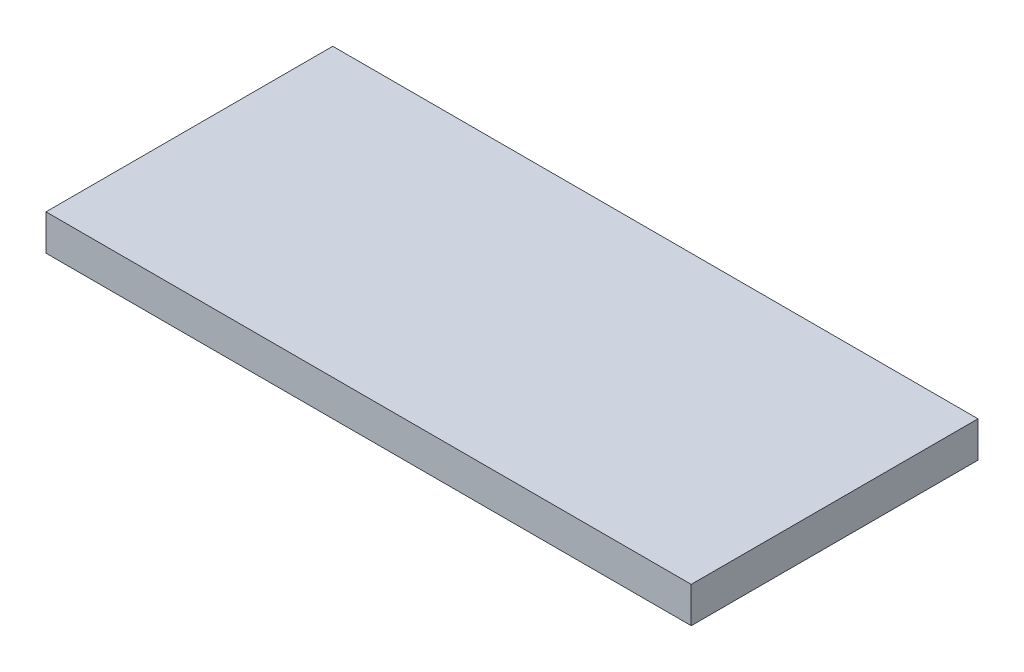
ISO-10303-21;
HEADER;
FILE_DESCRIPTION(('STEP AP214'),'2;1');
FILE_NAME('part.step','',(''),(''),'','','');
FILE_SCHEMA(('AUTOMOTIVE_DESIGN { 1 0 10303 214 1 1 1 1 }'));
ENDSEC;
DATA;
#1=APPLICATION_CONTEXT('core data for automotive mechanical design processes');
#2=APPLICATION_PROTOCOL_DEFINITION('international standard','automotive_design',2000,#1);
#3=PRODUCT_CONTEXT('',#1,'mechanical');
#4=PRODUCT('Part','Part','',(#3));
#5=PRODUCT_RELATED_PRODUCT_CATEGORY('part','',(#4));
#6=PRODUCT_DEFINITION_FORMATION('','',#4);
#7=PRODUCT_DEFINITION_CONTEXT('part definition',#1,'design');
#8=PRODUCT_DEFINITION('design','',#6,#7);
#9=PRODUCT_DEFINITION_SHAPE('','',#8);
#10=(LENGTH_UNIT() NAMED_UNIT(*) SI_UNIT(.MILLI.,.METRE.));
#11=(NAMED_UNIT(*) PLANE_ANGLE_UNIT() SI_UNIT($,.RADIAN.));
#12=(NAMED_UNIT(*) SI_UNIT($,.STERADIAN.) SOLID_ANGLE_UNIT());
#13=UNCERTAINTY_MEASURE_WITH_UNIT(LENGTH_MEASURE(1.E-05),#10,'distance_accuracy_value','');
#14=(GEOMETRIC_REPRESENTATION_CONTEXT(3) GLOBAL_UNCERTAINTY_ASSIGNED_CONTEXT((#13)) GLOBAL_UNIT_ASSIGNED_CONTEXT((#10,
#11,#12)) REPRESENTATION_CONTEXT('',''));
#15=CARTESIAN_POINT('',(0.,0.,0.));
#16=DIRECTION('',(0.,0.,1.));
#17=DIRECTION('',(1.,0.,0.));
#18=AXIS2_PLACEMENT_3D('',#15,#16,#17);
#19=CARTESIAN_POINT('',(450.,50.,-200.));
#20=DIRECTION('',(-1.,0.,0.));
#21=DIRECTION('',(0.,0.,1.));
#22=AXIS2_PLACEMENT_3D('',#19,#20,#21);
#23=PLANE('',#22);
#24=DIRECTION('',(0.,0.,-1.));
#25=VECTOR('',#24,1.);
#26=CARTESIAN_POINT('',(450.,0.,-200.));
#27=LINE('',#26,#25);
#28=CARTESIAN_POINT('',(450.,0.,200.));
#29=VERTEX_POINT('',#28);
#30=CARTESIAN_POINT('',(450.,0.,-200.));
#31=VERTEX_POINT('',#30);
#32=EDGE_CURVE('E97',#29,#31,#27,.T.);
#33=ORIENTED_EDGE('',*,*,#32,.T.);
#34=DIRECTION('',(0.,-1.,0.));
#35=VECTOR('',#34,1.);
#36=CARTESIAN_POINT('',(450.,50.,-200.));
#37=LINE('',#36,#35);
#38=CARTESIAN_POINT('',(450.,50.,-200.));
#39=VERTEX_POINT('',#38);
#40=EDGE_CURVE('E11',#39,#31,#37,.T.);
#41=ORIENTED_EDGE('',*,*,#40,.F.);
#42=DIRECTION('',(0.,0.,-1.));
#43=VECTOR('',#42,1.);
#44=CARTESIAN_POINT('',(450.,50.,-200.));
#45=LINE('',#44,#43);
#46=CARTESIAN_POINT('',(450.,50.,200.));
#47=VERTEX_POINT('',#46);
#48=EDGE_CURVE('E85',#47,#39,#45,.T.);
#49=ORIENTED_EDGE('',*,*,#48,.F.);
#50=DIRECTION('',(0.,-1.,0.));
#51=VECTOR('',#50,1.);
#52=CARTESIAN_POINT('',(450.,50.,200.));
#53=LINE('',#52,#51);
#54=EDGE_CURVE('E93',#47,#29,#53,.T.);
#55=ORIENTED_EDGE('',*,*,#54,.T.);
#56=EDGE_LOOP('',(#33,#41,#49,#55));
#57=FACE_BOUND('',#56,.T.);
#58=ADVANCED_FACE('F34',(#57),#23,.F.);
#59=CARTESIAN_POINT('',(-450.,50.,-200.));
#60=DIRECTION('',(0.,0.,1.));
#61=DIRECTION('',(1.,0.,0.));
#62=AXIS2_PLACEMENT_3D('',#59,#60,#61);
#63=PLANE('',#62);
#64=DIRECTION('',(-1.,0.,0.));
#65=VECTOR('',#64,1.);
#66=CARTESIAN_POINT('',(-450.,0.,-200.));
#67=LINE('',#66,#65);
#68=CARTESIAN_POINT('',(-450.,0.,-200.));
#69=VERTEX_POINT('',#68);
#70=EDGE_CURVE('E89',#31,#69,#67,.T.);
#71=ORIENTED_EDGE('',*,*,#70,.T.);
#72=DIRECTION('',(0.,-1.,0.));
#73=VECTOR('',#72,1.);
#74=CARTESIAN_POINT('',(-450.,50.,-200.));
#75=LINE('',#74,#73);
#76=CARTESIAN_POINT('',(-450.,50.,-200.));
#77=VERTEX_POINT('',#76);
#78=EDGE_CURVE('E42',#77,#69,#75,.T.);
#79=ORIENTED_EDGE('',*,*,#78,.F.);
#80=DIRECTION('',(-1.,0.,0.));
#81=VECTOR('',#80,1.);
#82=CARTESIAN_POINT('',(-450.,50.,-200.));
#83=LINE('',#82,#81);
#84=EDGE_CURVE('E80',#39,#77,#83,.T.);
#85=ORIENTED_EDGE('',*,*,#84,.F.);
#86=ORIENTED_EDGE('',*,*,#40,.T.);
#87=EDGE_LOOP('',(#71,#79,#85,#86));
#88=FACE_BOUND('',#87,.T.);
#89=ADVANCED_FACE('F88',(#88),#63,.F.);
#90=CARTESIAN_POINT('',(-450.,50.,-200.));
#91=DIRECTION('',(1.,0.,0.));
#92=DIRECTION('',(0.,0.,-1.));
#93=AXIS2_PLACEMENT_3D('',#90,#91,#92);
#94=PLANE('',#93);
#95=DIRECTION('',(0.,0.,1.));
#96=VECTOR('',#95,1.);
#97=CARTESIAN_POINT('',(-450.,0.,-200.));
#98=LINE('',#97,#96);
#99=CARTESIAN_POINT('',(-450.,0.,200.));
#100=VERTEX_POINT('',#99);
#101=EDGE_CURVE('E67',#69,#100,#98,.T.);
#102=ORIENTED_EDGE('',*,*,#101,.T.);
#103=DIRECTION('',(0.,-1.,0.));
#104=VECTOR('',#103,1.);
#105=CARTESIAN_POINT('',(-450.,50.,200.));
#106=LINE('',#105,#104);
#107=CARTESIAN_POINT('',(-450.,50.,200.));
#108=VERTEX_POINT('',#107);
#109=EDGE_CURVE('E90',#108,#100,#106,.T.);
#110=ORIENTED_EDGE('',*,*,#109,.F.);
#111=DIRECTION('',(0.,0.,1.));
#112=VECTOR('',#111,1.);
#113=CARTESIAN_POINT('',(-450.,50.,-200.));
#114=LINE('',#113,#112);
#115=EDGE_CURVE('E83',#77,#108,#114,.T.);
#116=ORIENTED_EDGE('',*,*,#115,.F.);
#117=ORIENTED_EDGE('',*,*,#78,.T.);
#118=EDGE_LOOP('',(#102,#110,#116,#117));
#119=FACE_BOUND('',#118,.T.);
#120=ADVANCED_FACE('F91',(#119),#94,.F.);
#121=CARTESIAN_POINT('',(-450.,50.,200.));
#122=DIRECTION('',(0.,0.,-1.));
#123=DIRECTION('',(-1.,0.,0.));
#124=AXIS2_PLACEMENT_3D('',#121,#122,#123);
#125=PLANE('',#124);
#126=DIRECTION('',(1.,0.,0.));
#127=VECTOR('',#126,1.);
#128=CARTESIAN_POINT('',(-450.,0.,200.));
#129=LINE('',#128,#127);
#130=EDGE_CURVE('E73',#100,#29,#129,.T.);
#131=ORIENTED_EDGE('',*,*,#130,.T.);
#132=ORIENTED_EDGE('',*,*,#54,.F.);
#133=DIRECTION('',(1.,0.,0.));
#134=VECTOR('',#133,1.);
#135=CARTESIAN_POINT('',(-450.,50.,200.));
#136=LINE('',#135,#134);
#137=EDGE_CURVE('E50',#108,#47,#136,.T.);
#138=ORIENTED_EDGE('',*,*,#137,.F.);
#139=ORIENTED_EDGE('',*,*,#109,.T.);
#140=EDGE_LOOP('',(#131,#132,#138,#139));
#141=FACE_BOUND('',#140,.T.);
#142=ADVANCED_FACE('F104',(#141),#125,.F.);
#143=CARTESIAN_POINT('',(0.,50.,0.));
#144=DIRECTION('',(0.,1.,0.));
#145=DIRECTION('',(0.,0.,1.));
#146=AXIS2_PLACEMENT_3D('',#143,#144,#145);
#147=PLANE('',#146);
#148=ORIENTED_EDGE('',*,*,#48,.T.);
#149=ORIENTED_EDGE('',*,*,#84,.T.);
#150=ORIENTED_EDGE('',*,*,#115,.T.);
#151=ORIENTED_EDGE('',*,*,#137,.T.);
#152=EDGE_LOOP('',(#148,#149,#150,#151));
#153=FACE_BOUND('',#152,.T.);
#154=ADVANCED_FACE('F81',(#153),#147,.T.);
#155=CARTESIAN_POINT('',(0.,0.,0.));
#156=DIRECTION('',(0.,1.,0.));
#157=DIRECTION('',(0.,0.,1.));
#158=AXIS2_PLACEMENT_3D('',#155,#156,#157);
#159=PLANE('',#158);
#160=ORIENTED_EDGE('',*,*,#32,.F.);
#161=ORIENTED_EDGE('',*,*,#130,.F.);
#162=ORIENTED_EDGE('',*,*,#101,.F.);
#163=ORIENTED_EDGE('',*,*,#70,.F.);
#164=EDGE_LOOP('',(#160,#161,#162,#163));
#165=FACE_BOUND('',#164,.T.);
#166=ADVANCED_FACE('F107',(#165),#159,.F.);
#167=CLOSED_SHELL('',(#58,#89,#120,#142,#154,#166));
#168=MANIFOLD_SOLID_BREP('B2',#167);
#169=ADVANCED_BREP_SHAPE_REPRESENTATION('',(#18,#168),#14);
#170=SHAPE_DEFINITION_REPRESENTATION(#9,#169);
ENDSEC;
END-ISO-10303-21;
